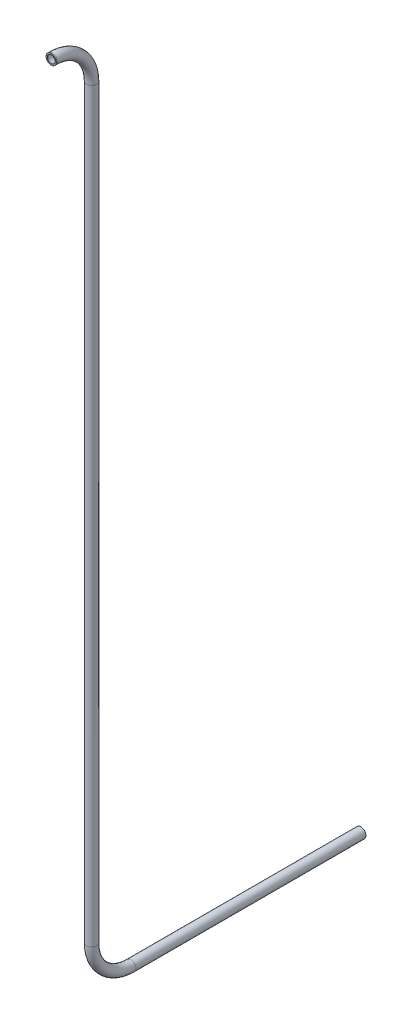
ISO-10303-21;
HEADER;
FILE_DESCRIPTION(('STEP AP214'),'2;1');
FILE_NAME('part.step','',(''),(''),'','','');
FILE_SCHEMA(('AUTOMOTIVE_DESIGN { 1 0 10303 214 1 1 1 1 }'));
ENDSEC;
DATA;
#1=APPLICATION_CONTEXT('core data for automotive mechanical design processes');
#2=APPLICATION_PROTOCOL_DEFINITION('international standard','automotive_design',2000,#1);
#3=PRODUCT_CONTEXT('',#1,'mechanical');
#4=PRODUCT('Part','Part','',(#3));
#5=PRODUCT_RELATED_PRODUCT_CATEGORY('part','',(#4));
#6=PRODUCT_DEFINITION_FORMATION('','',#4);
#7=PRODUCT_DEFINITION_CONTEXT('part definition',#1,'design');
#8=PRODUCT_DEFINITION('design','',#6,#7);
#9=PRODUCT_DEFINITION_SHAPE('','',#8);
#10=(LENGTH_UNIT() NAMED_UNIT(*) SI_UNIT(.MILLI.,.METRE.));
#11=(NAMED_UNIT(*) PLANE_ANGLE_UNIT() SI_UNIT($,.RADIAN.));
#12=(NAMED_UNIT(*) SI_UNIT($,.STERADIAN.) SOLID_ANGLE_UNIT());
#13=UNCERTAINTY_MEASURE_WITH_UNIT(LENGTH_MEASURE(1.E-05),#10,'distance_accuracy_value','');
#14=(GEOMETRIC_REPRESENTATION_CONTEXT(3) GLOBAL_UNCERTAINTY_ASSIGNED_CONTEXT((#13)) GLOBAL_UNIT_ASSIGNED_CONTEXT((#10,
#11,#12)) REPRESENTATION_CONTEXT('',''));
#15=CARTESIAN_POINT('',(0.,0.,0.));
#16=DIRECTION('',(0.,0.,1.));
#17=DIRECTION('',(1.,0.,0.));
#18=AXIS2_PLACEMENT_3D('',#15,#16,#17);
#19=CARTESIAN_POINT('',(0.,0.,0.));
#20=DIRECTION('',(0.,0.,1.));
#21=DIRECTION('',(1.,0.,0.));
#22=AXIS2_PLACEMENT_3D('',#19,#20,#21);
#23=PLANE('',#22);
#24=CARTESIAN_POINT('',(0.,0.,0.));
#25=DIRECTION('',(0.,0.,1.));
#26=DIRECTION('',(1.,0.,0.));
#27=AXIS2_PLACEMENT_3D('',#24,#25,#26);
#28=CIRCLE('',#27,0.6858);
#29=CARTESIAN_POINT('',(0.6858,0.,0.));
#30=VERTEX_POINT('',#29);
#31=EDGE_CURVE('E209',#30,#30,#28,.T.);
#32=ORIENTED_EDGE('',*,*,#31,.F.);
#33=EDGE_LOOP('',(#32));
#34=FACE_BOUND('',#33,.T.);
#35=CARTESIAN_POINT('',(0.,0.,0.));
#36=DIRECTION('',(0.,0.,1.));
#37=DIRECTION('',(1.,0.,0.));
#38=AXIS2_PLACEMENT_3D('',#35,#36,#37);
#39=CIRCLE('',#38,0.9144);
#40=CARTESIAN_POINT('',(0.9144,0.,0.));
#41=VERTEX_POINT('',#40);
#42=EDGE_CURVE('E68',#41,#41,#39,.T.);
#43=ORIENTED_EDGE('',*,*,#42,.T.);
#44=EDGE_LOOP('',(#43));
#45=FACE_BOUND('',#44,.T.);
#46=ADVANCED_FACE('F49',(#34,#45),#23,.T.);
#47=CARTESIAN_POINT('',(0.,-147.,-55.2));
#48=DIRECTION('',(0.,0.,1.));
#49=DIRECTION('',(1.,0.,0.));
#50=AXIS2_PLACEMENT_3D('',#47,#48,#49);
#51=PLANE('',#50);
#52=CARTESIAN_POINT('',(0.,-147.,-55.2));
#53=DIRECTION('',(0.,0.,1.));
#54=DIRECTION('',(1.,0.,0.));
#55=AXIS2_PLACEMENT_3D('',#52,#53,#54);
#56=CIRCLE('',#55,0.6858);
#57=CARTESIAN_POINT('',(0.6858,-147.,-55.2));
#58=VERTEX_POINT('',#57);
#59=EDGE_CURVE('E71',#58,#58,#56,.T.);
#60=ORIENTED_EDGE('',*,*,#59,.T.);
#61=EDGE_LOOP('',(#60));
#62=FACE_BOUND('',#61,.T.);
#63=CARTESIAN_POINT('',(0.,-147.,-55.2));
#64=DIRECTION('',(0.,0.,1.));
#65=DIRECTION('',(1.,0.,0.));
#66=AXIS2_PLACEMENT_3D('',#63,#64,#65);
#67=CIRCLE('',#66,0.9144);
#68=CARTESIAN_POINT('',(0.9144,-147.,-55.2));
#69=VERTEX_POINT('',#68);
#70=EDGE_CURVE('E11',#69,#69,#67,.T.);
#71=ORIENTED_EDGE('',*,*,#70,.F.);
#72=EDGE_LOOP('',(#71));
#73=FACE_BOUND('',#72,.T.);
#74=ADVANCED_FACE('F131',(#62,#73),#51,.F.);
#75=CARTESIAN_POINT('',(0.,0.,0.));
#76=DIRECTION('',(0.,0.,-1.));
#77=DIRECTION('',(-1.,0.,0.));
#78=AXIS2_PLACEMENT_3D('',#75,#76,#77);
#79=CYLINDRICAL_SURFACE('',#78,0.9144);
#80=CARTESIAN_POINT('',(0.,0.,-0.199999999999999));
#81=DIRECTION('',(0.,0.,-1.));
#82=DIRECTION('',(-1.,0.,0.));
#83=AXIS2_PLACEMENT_3D('',#80,#81,#82);
#84=CIRCLE('',#83,0.9144);
#85=CARTESIAN_POINT('',(0.,0.914399999999999,-0.199999999999999));
#86=VERTEX_POINT('',#85);
#87=EDGE_CURVE('E70',#86,#86,#84,.F.);
#88=ORIENTED_EDGE('',*,*,#87,.T.);
#89=EDGE_LOOP('',(#88));
#90=FACE_BOUND('',#89,.T.);
#91=ORIENTED_EDGE('',*,*,#42,.F.);
#92=EDGE_LOOP('',(#91));
#93=FACE_BOUND('',#92,.T.);
#94=ADVANCED_FACE('F100',(#90,#93),#79,.T.);
#95=CARTESIAN_POINT('',(0.,-7.,-0.200000000000001));
#96=DIRECTION('',(-1.,0.,0.));
#97=DIRECTION('',(0.,0.,1.));
#98=AXIS2_PLACEMENT_3D('',#95,#96,#97);
#99=TOROIDAL_SURFACE('',#98,7.,0.9144);
#100=CARTESIAN_POINT('',(0.,-7.00000000000002,-7.2));
#101=DIRECTION('',(0.,1.,0.));
#102=DIRECTION('',(0.,0.,1.));
#103=AXIS2_PLACEMENT_3D('',#100,#101,#102);
#104=CIRCLE('',#103,0.9144);
#105=CARTESIAN_POINT('',(0.,-7.00000000000003,-8.1144));
#106=VERTEX_POINT('',#105);
#107=EDGE_CURVE('E65',#106,#106,#104,.T.);
#108=CARTESIAN_POINT('',(0.,-7.,-0.200000000000001));
#109=DIRECTION('',(-1.,0.,0.));
#110=DIRECTION('',(0.,0.,1.));
#111=AXIS2_PLACEMENT_3D('',#108,#109,#110);
#112=CIRCLE('',#111,7.9144);
#113=EDGE_CURVE('',#86,#106,#112,.T.);
#114=ORIENTED_EDGE('',*,*,#87,.F.);
#115=ORIENTED_EDGE('',*,*,#107,.T.);
#116=ORIENTED_EDGE('',*,*,#113,.T.);
#117=ORIENTED_EDGE('',*,*,#113,.F.);
#118=EDGE_LOOP('',(#114,#116,#115,#117));
#119=FACE_BOUND('',#118,.T.);
#120=ADVANCED_FACE('F88',(#119),#99,.T.);
#121=CARTESIAN_POINT('',(0.,-7.00000000000003,-7.20000000000001));
#122=DIRECTION('',(0.,-1.,0.));
#123=DIRECTION('',(0.,0.,-1.));
#124=AXIS2_PLACEMENT_3D('',#121,#122,#123);
#125=CYLINDRICAL_SURFACE('',#124,0.9144);
#126=CARTESIAN_POINT('',(0.,-140.,-7.20000000000001));
#127=DIRECTION('',(0.,-1.,0.));
#128=DIRECTION('',(0.,0.,-1.));
#129=AXIS2_PLACEMENT_3D('',#126,#127,#128);
#130=CIRCLE('',#129,0.9144);
#131=CARTESIAN_POINT('',(0.,-140.,-6.28560000000001));
#132=VERTEX_POINT('',#131);
#133=EDGE_CURVE('E60',#132,#132,#130,.F.);
#134=ORIENTED_EDGE('',*,*,#133,.T.);
#135=EDGE_LOOP('',(#134));
#136=FACE_BOUND('',#135,.T.);
#137=ORIENTED_EDGE('',*,*,#107,.F.);
#138=EDGE_LOOP('',(#137));
#139=FACE_BOUND('',#138,.T.);
#140=ADVANCED_FACE('F91',(#136,#139),#125,.T.);
#141=CARTESIAN_POINT('',(0.,-140.,-14.2));
#142=DIRECTION('',(1.,0.,0.));
#143=DIRECTION('',(0.,0.,-1.));
#144=AXIS2_PLACEMENT_3D('',#141,#142,#143);
#145=TOROIDAL_SURFACE('',#144,6.99999999999996,0.9144);
#146=CARTESIAN_POINT('',(0.,-147.,-14.1999999999995));
#147=DIRECTION('',(0.,0.,1.));
#148=DIRECTION('',(0.,-1.,0.));
#149=AXIS2_PLACEMENT_3D('',#146,#147,#148);
#150=CIRCLE('',#149,0.9144);
#151=CARTESIAN_POINT('',(0.,-147.9144,-14.1999999999994));
#152=VERTEX_POINT('',#151);
#153=EDGE_CURVE('E56',#152,#152,#150,.T.);
#154=CARTESIAN_POINT('',(0.,-140.,-14.2));
#155=DIRECTION('',(1.,0.,0.));
#156=DIRECTION('',(0.,0.,-1.));
#157=AXIS2_PLACEMENT_3D('',#154,#155,#156);
#158=CIRCLE('',#157,7.91439999999996);
#159=EDGE_CURVE('',#132,#152,#158,.T.);
#160=ORIENTED_EDGE('',*,*,#133,.F.);
#161=ORIENTED_EDGE('',*,*,#153,.T.);
#162=ORIENTED_EDGE('',*,*,#159,.T.);
#163=ORIENTED_EDGE('',*,*,#159,.F.);
#164=EDGE_LOOP('',(#160,#162,#161,#163));
#165=FACE_BOUND('',#164,.T.);
#166=ADVANCED_FACE('F93',(#165),#145,.T.);
#167=CARTESIAN_POINT('',(0.,-147.,-14.2));
#168=DIRECTION('',(0.,0.,-1.));
#169=DIRECTION('',(-1.,0.,0.));
#170=AXIS2_PLACEMENT_3D('',#167,#168,#169);
#171=CYLINDRICAL_SURFACE('',#170,0.9144);
#172=ORIENTED_EDGE('',*,*,#70,.T.);
#173=EDGE_LOOP('',(#172));
#174=FACE_BOUND('',#173,.T.);
#175=ORIENTED_EDGE('',*,*,#153,.F.);
#176=EDGE_LOOP('',(#175));
#177=FACE_BOUND('',#176,.T.);
#178=ADVANCED_FACE('F51',(#174,#177),#171,.T.);
#179=CARTESIAN_POINT('',(0.,0.,0.));
#180=DIRECTION('',(0.,0.,-1.));
#181=DIRECTION('',(-1.,0.,0.));
#182=AXIS2_PLACEMENT_3D('',#179,#180,#181);
#183=CYLINDRICAL_SURFACE('',#182,0.6858);
#184=CARTESIAN_POINT('',(0.,0.,-0.199999999999999));
#185=DIRECTION('',(0.,0.,1.));
#186=DIRECTION('',(1.,0.,0.));
#187=AXIS2_PLACEMENT_3D('',#184,#185,#186);
#188=CIRCLE('',#187,0.6858);
#189=CARTESIAN_POINT('',(0.,0.6858,-0.199999999999999));
#190=VERTEX_POINT('',#189);
#191=EDGE_CURVE('E210',#190,#190,#188,.T.);
#192=ORIENTED_EDGE('',*,*,#191,.F.);
#193=EDGE_LOOP('',(#192));
#194=FACE_BOUND('',#193,.T.);
#195=ORIENTED_EDGE('',*,*,#31,.T.);
#196=EDGE_LOOP('',(#195));
#197=FACE_BOUND('',#196,.T.);
#198=ADVANCED_FACE('F103',(#194,#197),#183,.F.);
#199=CARTESIAN_POINT('',(0.,-7.,-0.200000000000001));
#200=DIRECTION('',(-1.,0.,0.));
#201=DIRECTION('',(0.,0.,1.));
#202=AXIS2_PLACEMENT_3D('',#199,#200,#201);
#203=TOROIDAL_SURFACE('',#202,7.,0.6858);
#204=CARTESIAN_POINT('',(0.,-7.00000000000003,-7.20000000000001));
#205=DIRECTION('',(0.,1.,0.));
#206=DIRECTION('',(1.,0.,0.));
#207=AXIS2_PLACEMENT_3D('',#204,#205,#206);
#208=CIRCLE('',#207,0.6858);
#209=CARTESIAN_POINT('',(0.,-7.00000000000003,-7.8858));
#210=VERTEX_POINT('',#209);
#211=EDGE_CURVE('E213',#210,#210,#208,.T.);
#212=CARTESIAN_POINT('',(0.,-7.,-0.200000000000001));
#213=DIRECTION('',(-1.,0.,0.));
#214=DIRECTION('',(0.,0.,1.));
#215=AXIS2_PLACEMENT_3D('',#212,#213,#214);
#216=CIRCLE('',#215,7.6858);
#217=EDGE_CURVE('',#190,#210,#216,.T.);
#218=ORIENTED_EDGE('',*,*,#191,.T.);
#219=ORIENTED_EDGE('',*,*,#211,.F.);
#220=ORIENTED_EDGE('',*,*,#217,.T.);
#221=ORIENTED_EDGE('',*,*,#217,.F.);
#222=EDGE_LOOP('',(#218,#220,#219,#221));
#223=FACE_BOUND('',#222,.T.);
#224=ADVANCED_FACE('F107',(#223),#203,.F.);
#225=CARTESIAN_POINT('',(0.,-7.00000000000003,-7.20000000000001));
#226=DIRECTION('',(0.,-1.,0.));
#227=DIRECTION('',(0.,0.,-1.));
#228=AXIS2_PLACEMENT_3D('',#225,#226,#227);
#229=CYLINDRICAL_SURFACE('',#228,0.6858);
#230=CARTESIAN_POINT('',(0.,-140.,-7.20000000000001));
#231=DIRECTION('',(0.,1.,0.));
#232=DIRECTION('',(1.,0.,0.));
#233=AXIS2_PLACEMENT_3D('',#230,#231,#232);
#234=CIRCLE('',#233,0.6858);
#235=CARTESIAN_POINT('',(0.,-140.,-6.51420000000001));
#236=VERTEX_POINT('',#235);
#237=EDGE_CURVE('E82',#236,#236,#234,.T.);
#238=ORIENTED_EDGE('',*,*,#237,.F.);
#239=EDGE_LOOP('',(#238));
#240=FACE_BOUND('',#239,.T.);
#241=ORIENTED_EDGE('',*,*,#211,.T.);
#242=EDGE_LOOP('',(#241));
#243=FACE_BOUND('',#242,.T.);
#244=ADVANCED_FACE('F114',(#240,#243),#229,.F.);
#245=CARTESIAN_POINT('',(0.,-140.,-14.2));
#246=DIRECTION('',(1.,0.,0.));
#247=DIRECTION('',(0.,0.,-1.));
#248=AXIS2_PLACEMENT_3D('',#245,#246,#247);
#249=TOROIDAL_SURFACE('',#248,6.99999999999996,0.6858);
#250=CARTESIAN_POINT('',(0.,-147.,-14.1999999999995));
#251=DIRECTION('',(0.,0.,1.));
#252=DIRECTION('',(1.,0.,0.));
#253=AXIS2_PLACEMENT_3D('',#250,#251,#252);
#254=CIRCLE('',#253,0.6858);
#255=CARTESIAN_POINT('',(0.,-147.6858,-14.1999999999994));
#256=VERTEX_POINT('',#255);
#257=EDGE_CURVE('E77',#256,#256,#254,.T.);
#258=CARTESIAN_POINT('',(0.,-140.,-14.2));
#259=DIRECTION('',(1.,0.,0.));
#260=DIRECTION('',(0.,0.,-1.));
#261=AXIS2_PLACEMENT_3D('',#258,#259,#260);
#262=CIRCLE('',#261,7.68579999999996);
#263=EDGE_CURVE('',#236,#256,#262,.T.);
#264=ORIENTED_EDGE('',*,*,#237,.T.);
#265=ORIENTED_EDGE('',*,*,#257,.F.);
#266=ORIENTED_EDGE('',*,*,#263,.T.);
#267=ORIENTED_EDGE('',*,*,#263,.F.);
#268=EDGE_LOOP('',(#264,#266,#265,#267));
#269=FACE_BOUND('',#268,.T.);
#270=ADVANCED_FACE('F122',(#269),#249,.F.);
#271=CARTESIAN_POINT('',(0.,-147.,-14.2));
#272=DIRECTION('',(0.,0.,-1.));
#273=DIRECTION('',(-1.,0.,0.));
#274=AXIS2_PLACEMENT_3D('',#271,#272,#273);
#275=CYLINDRICAL_SURFACE('',#274,0.6858);
#276=ORIENTED_EDGE('',*,*,#59,.F.);
#277=EDGE_LOOP('',(#276));
#278=FACE_BOUND('',#277,.T.);
#279=ORIENTED_EDGE('',*,*,#257,.T.);
#280=EDGE_LOOP('',(#279));
#281=FACE_BOUND('',#280,.T.);
#282=ADVANCED_FACE('F126',(#278,#281),#275,.F.);
#283=CLOSED_SHELL('',(#46,#74,#94,#120,#140,#166,#178,#198,#224,#244,#270,#282));
#284=MANIFOLD_SOLID_BREP('B2',#283);
#285=ADVANCED_BREP_SHAPE_REPRESENTATION('',(#18,#284),#14);
#286=SHAPE_DEFINITION_REPRESENTATION(#9,#285);
ENDSEC;
END-ISO-10303-21;
